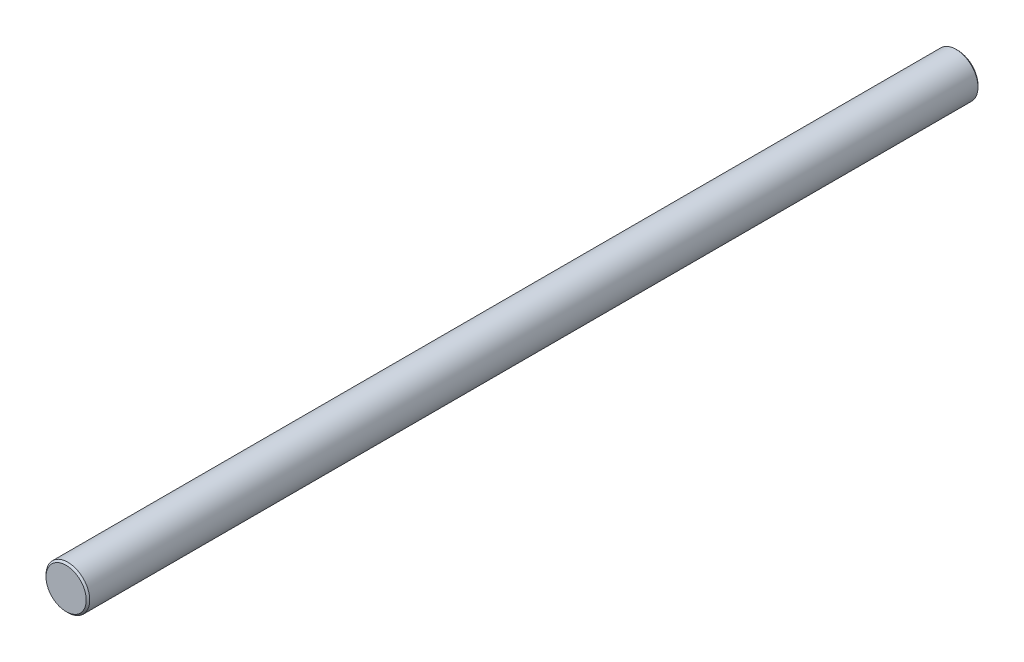
ISO-10303-21;
HEADER;
FILE_DESCRIPTION(('STEP AP214'),'2;1');
FILE_NAME('part.step','',(''),(''),'','','');
FILE_SCHEMA(('AUTOMOTIVE_DESIGN { 1 0 10303 214 1 1 1 1 }'));
ENDSEC;
DATA;
#1=APPLICATION_CONTEXT('core data for automotive mechanical design processes');
#2=APPLICATION_PROTOCOL_DEFINITION('international standard','automotive_design',2000,#1);
#3=PRODUCT_CONTEXT('',#1,'mechanical');
#4=PRODUCT('Part','Part','',(#3));
#5=PRODUCT_RELATED_PRODUCT_CATEGORY('part','',(#4));
#6=PRODUCT_DEFINITION_FORMATION('','',#4);
#7=PRODUCT_DEFINITION_CONTEXT('part definition',#1,'design');
#8=PRODUCT_DEFINITION('design','',#6,#7);
#9=PRODUCT_DEFINITION_SHAPE('','',#8);
#10=(LENGTH_UNIT() NAMED_UNIT(*) SI_UNIT(.MILLI.,.METRE.));
#11=(NAMED_UNIT(*) PLANE_ANGLE_UNIT() SI_UNIT($,.RADIAN.));
#12=(NAMED_UNIT(*) SI_UNIT($,.STERADIAN.) SOLID_ANGLE_UNIT());
#13=UNCERTAINTY_MEASURE_WITH_UNIT(LENGTH_MEASURE(1.E-05),#10,'distance_accuracy_value','');
#14=(GEOMETRIC_REPRESENTATION_CONTEXT(3) GLOBAL_UNCERTAINTY_ASSIGNED_CONTEXT((#13)) GLOBAL_UNIT_ASSIGNED_CONTEXT((#10,
#11,#12)) REPRESENTATION_CONTEXT('',''));
#15=CARTESIAN_POINT('',(0.,0.,0.));
#16=DIRECTION('',(0.,0.,1.));
#17=DIRECTION('',(1.,0.,0.));
#18=AXIS2_PLACEMENT_3D('',#15,#16,#17);
#19=CARTESIAN_POINT('',(0.,0.,255.));
#20=DIRECTION('',(0.,0.,-0.999999999999999));
#21=DIRECTION('',(-1.,0.,0.));
#22=AXIS2_PLACEMENT_3D('',#19,#20,#21);
#23=CYLINDRICAL_SURFACE('',#22,12.5);
#24=CARTESIAN_POINT('',(0.,0.,-254.));
#25=DIRECTION('',(0.,0.,0.999999999999999));
#26=DIRECTION('',(1.,0.,0.));
#27=AXIS2_PLACEMENT_3D('',#24,#25,#26);
#28=CIRCLE('',#27,12.5);
#29=CARTESIAN_POINT('',(-12.5,0.,-254.));
#30=VERTEX_POINT('',#29);
#31=EDGE_CURVE('E56',#30,#30,#28,.T.);
#32=CARTESIAN_POINT('',(0.,0.,254.));
#33=DIRECTION('',(0.,0.,0.999999999999999));
#34=DIRECTION('',(1.,0.,0.));
#35=AXIS2_PLACEMENT_3D('',#32,#33,#34);
#36=CIRCLE('',#35,12.5);
#37=CARTESIAN_POINT('',(-12.5,0.,254.));
#38=VERTEX_POINT('',#37);
#39=EDGE_CURVE('E60',#38,#38,#36,.F.);
#40=CARTESIAN_POINT('',(-12.5,0.,-254.));
#41=CARTESIAN_POINT('',(-12.5,0.,-248.708333333333));
#42=CARTESIAN_POINT('',(-12.5,0.,-243.416666666666));
#43=CARTESIAN_POINT('',(-12.5,0.,-232.833333333333));
#44=CARTESIAN_POINT('',(-12.5,0.,-227.541666666666));
#45=CARTESIAN_POINT('',(-12.5,0.,-216.958333333333));
#46=CARTESIAN_POINT('',(-12.5,0.,-211.666666666666));
#47=CARTESIAN_POINT('',(-12.5,0.,-201.083333333333));
#48=CARTESIAN_POINT('',(-12.5,0.,-195.791666666666));
#49=CARTESIAN_POINT('',(-12.5,0.,-185.208333333333));
#50=CARTESIAN_POINT('',(-12.5,0.,-179.916666666666));
#51=CARTESIAN_POINT('',(-12.5,0.,-169.333333333333));
#52=CARTESIAN_POINT('',(-12.5,0.,-164.041666666666));
#53=CARTESIAN_POINT('',(-12.5,0.,-153.458333333333));
#54=CARTESIAN_POINT('',(-12.5,0.,-148.166666666666));
#55=CARTESIAN_POINT('',(-12.5,0.,-137.583333333333));
#56=CARTESIAN_POINT('',(-12.5,0.,-132.291666666666));
#57=CARTESIAN_POINT('',(-12.5,0.,-121.708333333333));
#58=CARTESIAN_POINT('',(-12.5,0.,-116.416666666666));
#59=CARTESIAN_POINT('',(-12.5,0.,-105.833333333333));
#60=CARTESIAN_POINT('',(-12.5,0.,-100.541666666666));
#61=CARTESIAN_POINT('',(-12.5,0.,-89.9583333333331));
#62=CARTESIAN_POINT('',(-12.5,0.,-84.6666666666664));
#63=CARTESIAN_POINT('',(-12.5,0.,-74.0833333333331));
#64=CARTESIAN_POINT('',(-12.5,0.,-68.7916666666664));
#65=CARTESIAN_POINT('',(-12.5,0.,-58.2083333333331));
#66=CARTESIAN_POINT('',(-12.5,0.,-52.9166666666665));
#67=CARTESIAN_POINT('',(-12.5,0.,-42.3333333333331));
#68=CARTESIAN_POINT('',(-12.5,0.,-37.0416666666665));
#69=CARTESIAN_POINT('',(-12.5,0.,-26.4583333333331));
#70=CARTESIAN_POINT('',(-12.5,0.,-21.1666666666665));
#71=CARTESIAN_POINT('',(-12.5,0.,-10.5833333333331));
#72=CARTESIAN_POINT('',(-12.5,0.,-5.29166666666649));
#73=CARTESIAN_POINT('',(-12.5,0.,5.29166666666682));
#74=CARTESIAN_POINT('',(-12.5,0.,10.5833333333335));
#75=CARTESIAN_POINT('',(-12.5,0.,21.1666666666668));
#76=CARTESIAN_POINT('',(-12.5,0.,26.4583333333335));
#77=CARTESIAN_POINT('',(-12.5,0.,37.0416666666668));
#78=CARTESIAN_POINT('',(-12.5,0.,42.3333333333335));
#79=CARTESIAN_POINT('',(-12.5,0.,52.9166666666668));
#80=CARTESIAN_POINT('',(-12.5,0.,58.2083333333335));
#81=CARTESIAN_POINT('',(-12.5,0.,68.7916666666668));
#82=CARTESIAN_POINT('',(-12.5,0.,74.0833333333334));
#83=CARTESIAN_POINT('',(-12.5,0.,84.6666666666668));
#84=CARTESIAN_POINT('',(-12.5,0.,89.9583333333334));
#85=CARTESIAN_POINT('',(-12.5,0.,100.541666666667));
#86=CARTESIAN_POINT('',(-12.5,0.,105.833333333333));
#87=CARTESIAN_POINT('',(-12.5,0.,116.416666666667));
#88=CARTESIAN_POINT('',(-12.5,0.,121.708333333333));
#89=CARTESIAN_POINT('',(-12.5,0.,132.291666666667));
#90=CARTESIAN_POINT('',(-12.5,0.,137.583333333333));
#91=CARTESIAN_POINT('',(-12.5,0.,148.166666666667));
#92=CARTESIAN_POINT('',(-12.5,0.,153.458333333333));
#93=CARTESIAN_POINT('',(-12.5,0.,164.041666666667));
#94=CARTESIAN_POINT('',(-12.5,0.,169.333333333333));
#95=CARTESIAN_POINT('',(-12.5,0.,179.916666666667));
#96=CARTESIAN_POINT('',(-12.5,0.,185.208333333333));
#97=CARTESIAN_POINT('',(-12.5,0.,195.791666666667));
#98=CARTESIAN_POINT('',(-12.5,0.,201.083333333333));
#99=CARTESIAN_POINT('',(-12.5,0.,211.666666666667));
#100=CARTESIAN_POINT('',(-12.5,0.,216.958333333333));
#101=CARTESIAN_POINT('',(-12.5,0.,227.541666666667));
#102=CARTESIAN_POINT('',(-12.5,0.,232.833333333333));
#103=CARTESIAN_POINT('',(-12.5,0.,243.416666666667));
#104=CARTESIAN_POINT('',(-12.5,0.,248.708333333333));
#105=CARTESIAN_POINT('',(-12.5,0.,254.));
#106=B_SPLINE_CURVE_WITH_KNOTS('',3,(#40,#41,#42,#43,#44,#45,#46,#47,#48,#49,#50,#51,#52,#53,
#54,#55,#56,#57,#58,#59,#60,#61,#62,#63,#64,#65,#66,#67,#68,#69,#70,#71,#72,#73,#74,#75,#76,#77,
#78,#79,#80,#81,#82,#83,#84,#85,#86,#87,#88,#89,#90,#91,#92,#93,#94,#95,#96,#97,#98,#99,#100,
#101,#102,#103,#104,#105),.UNSPECIFIED.,.F.,.F.,(4,2,2,2,2,2,2,2,2,2,2,2,2,2,2,2,2,2,2,2,2,2,2,
2,2,2,2,2,2,2,2,2,4),(0.,15.875,31.75,47.625,63.4999999999999,79.3749999999999,95.2499999999999,
111.125,127.,142.875,158.75,174.625,190.5,206.375,222.25,238.125,254.,269.875,285.75,301.625,
317.5,333.375,349.25,365.125,381.,396.875,412.749999999999,428.624999999999,444.499999999999,
460.374999999999,476.249999999999,492.124999999999,507.999999999999),.UNSPECIFIED.);
#107=EDGE_CURVE('BSEAM45',#30,#38,#106,.T.);
#108=ORIENTED_EDGE('',*,*,#31,.T.);
#109=ORIENTED_EDGE('',*,*,#39,.T.);
#110=ORIENTED_EDGE('',*,*,#107,.T.);
#111=ORIENTED_EDGE('',*,*,#107,.F.);
#112=EDGE_LOOP('',(#108,#110,#109,#111));
#113=FACE_BOUND('',#112,.T.);
#114=ADVANCED_FACE('F45',(#113),#23,.T.);
#115=CARTESIAN_POINT('',(0.,0.,255.));
#116=DIRECTION('',(0.,0.,0.999999999999999));
#117=DIRECTION('',(1.,0.,0.));
#118=AXIS2_PLACEMENT_3D('',#115,#116,#117);
#119=PLANE('',#118);
#120=CARTESIAN_POINT('',(0.,0.,255.));
#121=DIRECTION('',(0.,0.,0.999999999999999));
#122=DIRECTION('',(1.,0.,0.));
#123=AXIS2_PLACEMENT_3D('',#120,#121,#122);
#124=CIRCLE('',#123,11.5000000000002);
#125=CARTESIAN_POINT('',(-11.5000000000001,0.,255.));
#126=VERTEX_POINT('',#125);
#127=EDGE_CURVE('E12',#126,#126,#124,.T.);
#128=ORIENTED_EDGE('',*,*,#127,.T.);
#129=EDGE_LOOP('',(#128));
#130=FACE_BOUND('',#129,.T.);
#131=ADVANCED_FACE('F76',(#130),#119,.T.);
#132=CARTESIAN_POINT('',(0.,0.,-255.));
#133=DIRECTION('',(0.,0.,0.999999999999999));
#134=DIRECTION('',(1.,0.,0.));
#135=AXIS2_PLACEMENT_3D('',#132,#133,#134);
#136=PLANE('',#135);
#137=CARTESIAN_POINT('',(0.,0.,-255.));
#138=DIRECTION('',(0.,0.,0.999999999999999));
#139=DIRECTION('',(1.,0.,0.));
#140=AXIS2_PLACEMENT_3D('',#137,#138,#139);
#141=CIRCLE('',#140,11.5);
#142=CARTESIAN_POINT('',(11.5,0.,-255.));
#143=VERTEX_POINT('',#142);
#144=EDGE_CURVE('E52',#143,#143,#141,.F.);
#145=ORIENTED_EDGE('',*,*,#144,.T.);
#146=EDGE_LOOP('',(#145));
#147=FACE_BOUND('',#146,.T.);
#148=ADVANCED_FACE('F73',(#147),#136,.F.);
#149=CARTESIAN_POINT('',(0.,0.,-254.));
#150=DIRECTION('',(0.,0.,0.999999999999999));
#151=DIRECTION('',(1.,0.,0.));
#152=AXIS2_PLACEMENT_3D('',#149,#150,#151);
#153=CONICAL_SURFACE('',#152,12.5,0.785398163397415);
#154=ORIENTED_EDGE('',*,*,#144,.F.);
#155=EDGE_LOOP('',(#154));
#156=FACE_BOUND('',#155,.T.);
#157=ORIENTED_EDGE('',*,*,#31,.F.);
#158=EDGE_LOOP('',(#157));
#159=FACE_BOUND('',#158,.T.);
#160=ADVANCED_FACE('F69',(#156,#159),#153,.T.);
#161=CARTESIAN_POINT('',(0.,0.,255.));
#162=DIRECTION('',(0.,0.,-0.999999999999999));
#163=DIRECTION('',(-1.,0.,0.));
#164=AXIS2_PLACEMENT_3D('',#161,#162,#163);
#165=CONICAL_SURFACE('',#164,11.5000000000002,0.785398163397415);
#166=CARTESIAN_POINT('',(-12.5,0.,254.));
#167=CARTESIAN_POINT('',(-12.4895833333333,0.,254.010416666667));
#168=CARTESIAN_POINT('',(-12.4791666666666,0.,254.020833333333));
#169=CARTESIAN_POINT('',(-12.4583333333333,0.,254.041666666667));
#170=CARTESIAN_POINT('',(-12.4479166666666,0.,254.052083333333));
#171=CARTESIAN_POINT('',(-12.4270833333333,0.,254.072916666667));
#172=CARTESIAN_POINT('',(-12.4166666666667,0.,254.083333333333));
#173=CARTESIAN_POINT('',(-12.3958333333333,0.,254.104166666667));
#174=CARTESIAN_POINT('',(-12.3854166666666,0.,254.114583333333));
#175=CARTESIAN_POINT('',(-12.3645833333333,0.,254.135416666667));
#176=CARTESIAN_POINT('',(-12.3541666666667,0.,254.145833333333));
#177=CARTESIAN_POINT('',(-12.3333333333333,0.,254.166666666667));
#178=CARTESIAN_POINT('',(-12.3229166666667,0.,254.177083333333));
#179=CARTESIAN_POINT('',(-12.3020833333333,0.,254.197916666667));
#180=CARTESIAN_POINT('',(-12.2916666666667,0.,254.208333333333));
#181=CARTESIAN_POINT('',(-12.2708333333333,0.,254.229166666667));
#182=CARTESIAN_POINT('',(-12.2604166666667,0.,254.239583333333));
#183=CARTESIAN_POINT('',(-12.2395833333334,0.,254.260416666667));
#184=CARTESIAN_POINT('',(-12.2291666666667,0.,254.270833333333));
#185=CARTESIAN_POINT('',(-12.2083333333333,0.,254.291666666667));
#186=CARTESIAN_POINT('',(-12.1979166666667,0.,254.302083333333));
#187=CARTESIAN_POINT('',(-12.1770833333334,0.,254.322916666667));
#188=CARTESIAN_POINT('',(-12.1666666666667,0.,254.333333333333));
#189=CARTESIAN_POINT('',(-12.1458333333334,0.,254.354166666667));
#190=CARTESIAN_POINT('',(-12.1354166666667,0.,254.364583333333));
#191=CARTESIAN_POINT('',(-12.1145833333334,0.,254.385416666667));
#192=CARTESIAN_POINT('',(-12.1041666666667,0.,254.395833333333));
#193=CARTESIAN_POINT('',(-12.0833333333334,0.,254.416666666667));
#194=CARTESIAN_POINT('',(-12.0729166666667,0.,254.427083333333));
#195=CARTESIAN_POINT('',(-12.0520833333334,0.,254.447916666667));
#196=CARTESIAN_POINT('',(-12.0416666666667,0.,254.458333333333));
#197=CARTESIAN_POINT('',(-12.0208333333334,0.,254.479166666667));
#198=CARTESIAN_POINT('',(-12.0104166666667,0.,254.489583333333));
#199=CARTESIAN_POINT('',(-11.9895833333334,0.,254.510416666667));
#200=CARTESIAN_POINT('',(-11.9791666666667,0.,254.520833333333));
#201=CARTESIAN_POINT('',(-11.9583333333334,0.,254.541666666667));
#202=CARTESIAN_POINT('',(-11.9479166666667,0.,254.552083333333));
#203=CARTESIAN_POINT('',(-11.9270833333334,0.,254.572916666667));
#204=CARTESIAN_POINT('',(-11.9166666666667,0.,254.583333333333));
#205=CARTESIAN_POINT('',(-11.8958333333334,0.,254.604166666667));
#206=CARTESIAN_POINT('',(-11.8854166666667,0.,254.614583333333));
#207=CARTESIAN_POINT('',(-11.8645833333334,0.,254.635416666667));
#208=CARTESIAN_POINT('',(-11.8541666666668,0.,254.645833333333));
#209=CARTESIAN_POINT('',(-11.8333333333334,0.,254.666666666667));
#210=CARTESIAN_POINT('',(-11.8229166666668,0.,254.677083333333));
#211=CARTESIAN_POINT('',(-11.8020833333334,0.,254.697916666667));
#212=CARTESIAN_POINT('',(-11.7916666666668,0.,254.708333333333));
#213=CARTESIAN_POINT('',(-11.7708333333334,0.,254.729166666667));
#214=CARTESIAN_POINT('',(-11.7604166666668,0.,254.739583333333));
#215=CARTESIAN_POINT('',(-11.7395833333334,0.,254.760416666667));
#216=CARTESIAN_POINT('',(-11.7291666666668,0.,254.770833333333));
#217=CARTESIAN_POINT('',(-11.7083333333334,0.,254.791666666667));
#218=CARTESIAN_POINT('',(-11.6979166666668,0.,254.802083333333));
#219=CARTESIAN_POINT('',(-11.6770833333334,0.,254.822916666667));
#220=CARTESIAN_POINT('',(-11.6666666666668,0.,254.833333333333));
#221=CARTESIAN_POINT('',(-11.6458333333334,0.,254.854166666667));
#222=CARTESIAN_POINT('',(-11.6354166666668,0.,254.864583333333));
#223=CARTESIAN_POINT('',(-11.6145833333335,0.,254.885416666667));
#224=CARTESIAN_POINT('',(-11.6041666666668,0.,254.895833333333));
#225=CARTESIAN_POINT('',(-11.5833333333335,0.,254.916666666667));
#226=CARTESIAN_POINT('',(-11.5729166666668,0.,254.927083333333));
#227=CARTESIAN_POINT('',(-11.5520833333335,0.,254.947916666667));
#228=CARTESIAN_POINT('',(-11.5416666666668,0.,254.958333333333));
#229=CARTESIAN_POINT('',(-11.5208333333335,0.,254.979166666667));
#230=CARTESIAN_POINT('',(-11.5104166666668,0.,254.989583333333));
#231=CARTESIAN_POINT('',(-11.5000000000001,0.,255.));
#232=B_SPLINE_CURVE_WITH_KNOTS('',3,(#166,#167,#168,#169,#170,#171,#172,#173,#174,#175,#176,
#177,#178,#179,#180,#181,#182,#183,#184,#185,#186,#187,#188,#189,#190,#191,#192,#193,#194,#195,
#196,#197,#198,#199,#200,#201,#202,#203,#204,#205,#206,#207,#208,#209,#210,#211,#212,#213,#214,
#215,#216,#217,#218,#219,#220,#221,#222,#223,#224,#225,#226,#227,#228,#229,#230,#231),
.UNSPECIFIED.,.F.,.F.,(4,2,2,2,2,2,2,2,2,2,2,2,2,2,2,2,2,2,2,2,2,2,2,2,2,2,2,2,2,2,2,2,4),(0.,
0.0441941738241421,0.0883883476482854,0.132582521472429,0.176776695296572,0.220970869120755,
0.265165042944897,0.30935921676904,0.353553390593223,0.397747564417366,0.441941738241509,
0.486135912065653,0.530330085889795,0.574524259713977,0.618718433538121,0.662912607362264,
0.707106781186447,0.75130095501059,0.795495128834732,0.839689302658875,0.883883476483019,
0.928077650307201,0.972271824131345,1.01646599795549,1.06066017177967,1.10485434560381,
1.14904851942796,1.1932426932521,1.23743686707624,1.28163104090042,1.32582521472457,
1.37001938854871,1.41421356237285),.UNSPECIFIED.);
#233=EDGE_CURVE('BSEAM47',#38,#126,#232,.T.);
#234=ORIENTED_EDGE('',*,*,#39,.F.);
#235=ORIENTED_EDGE('',*,*,#127,.F.);
#236=ORIENTED_EDGE('',*,*,#233,.T.);
#237=ORIENTED_EDGE('',*,*,#233,.F.);
#238=EDGE_LOOP('',(#234,#236,#235,#237));
#239=FACE_BOUND('',#238,.T.);
#240=ADVANCED_FACE('F47',(#239),#165,.T.);
#241=CLOSED_SHELL('',(#114,#131,#148,#160,#240));
#242=MANIFOLD_SOLID_BREP('B2',#241);
#243=ADVANCED_BREP_SHAPE_REPRESENTATION('',(#18,#242),#14);
#244=SHAPE_DEFINITION_REPRESENTATION(#9,#243);
ENDSEC;
END-ISO-10303-21;
